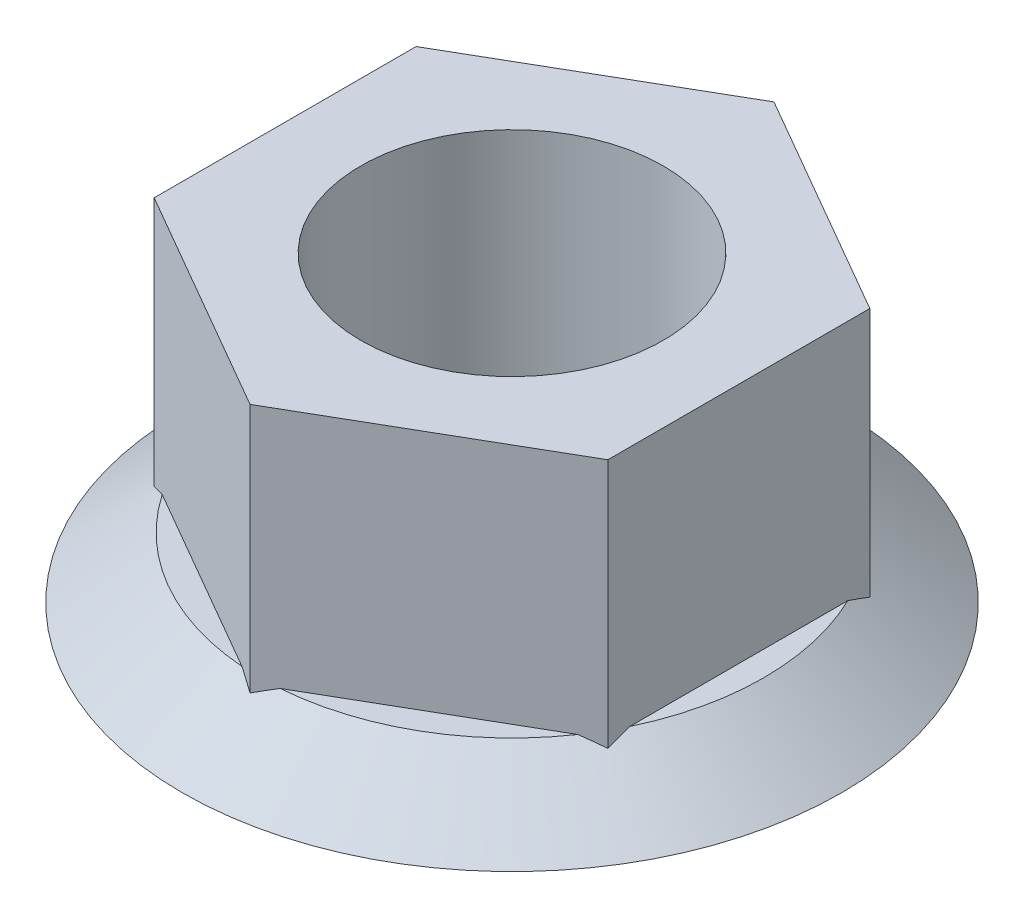
ISO-10303-21;
HEADER;
FILE_DESCRIPTION(('STEP AP214'),'2;1');
FILE_NAME('part.step','',(''),(''),'','','');
FILE_SCHEMA(('AUTOMOTIVE_DESIGN { 1 0 10303 214 1 1 1 1 }'));
ENDSEC;
DATA;
#1=APPLICATION_CONTEXT('core data for automotive mechanical design processes');
#2=APPLICATION_PROTOCOL_DEFINITION('international standard','automotive_design',2000,#1);
#3=PRODUCT_CONTEXT('',#1,'mechanical');
#4=PRODUCT('Part','Part','',(#3));
#5=PRODUCT_RELATED_PRODUCT_CATEGORY('part','',(#4));
#6=PRODUCT_DEFINITION_FORMATION('','',#4);
#7=PRODUCT_DEFINITION_CONTEXT('part definition',#1,'design');
#8=PRODUCT_DEFINITION('design','',#6,#7);
#9=PRODUCT_DEFINITION_SHAPE('','',#8);
#10=(LENGTH_UNIT() NAMED_UNIT(*) SI_UNIT(.MILLI.,.METRE.));
#11=(NAMED_UNIT(*) PLANE_ANGLE_UNIT() SI_UNIT($,.RADIAN.));
#12=(NAMED_UNIT(*) SI_UNIT($,.STERADIAN.) SOLID_ANGLE_UNIT());
#13=UNCERTAINTY_MEASURE_WITH_UNIT(LENGTH_MEASURE(1.E-05),#10,'distance_accuracy_value','');
#14=(GEOMETRIC_REPRESENTATION_CONTEXT(3) GLOBAL_UNCERTAINTY_ASSIGNED_CONTEXT((#13)) GLOBAL_UNIT_ASSIGNED_CONTEXT((#10,
#11,#12)) REPRESENTATION_CONTEXT('',''));
#15=CARTESIAN_POINT('',(0.,0.,0.));
#16=DIRECTION('',(0.,0.,1.));
#17=DIRECTION('',(1.,0.,0.));
#18=AXIS2_PLACEMENT_3D('',#15,#16,#17);
#19=CARTESIAN_POINT('',(5.,2.,0.));
#20=DIRECTION('',(0.,1.,0.));
#21=DIRECTION('',(0.,0.,1.));
#22=AXIS2_PLACEMENT_3D('',#19,#20,#21);
#23=PLANE('',#22);
#24=DIRECTION('',(0.866025403784439,0.,-0.5));
#25=VECTOR('',#24,1.);
#26=CARTESIAN_POINT('',(7.5,2.,4.3301270189222));
#27=LINE('',#26,#25);
#28=CARTESIAN_POINT('',(0.630817414770335,2.,8.29605143361723));
#29=VERTEX_POINT('',#28);
#30=CARTESIAN_POINT('',(6.86918258522966,2.,4.69432962314936));
#31=VERTEX_POINT('',#30);
#32=EDGE_CURVE('E202',#29,#31,#27,.T.);
#33=ORIENTED_EDGE('',*,*,#32,.F.);
#34=CARTESIAN_POINT('',(0.,2.,0.));
#35=DIRECTION('',(0.,-1.,0.));
#36=DIRECTION('',(0.,0.,-1.));
#37=AXIS2_PLACEMENT_3D('',#34,#35,#36);
#38=CIRCLE('',#37,8.32);
#39=EDGE_CURVE('E382',#31,#29,#38,.T.);
#40=ORIENTED_EDGE('',*,*,#39,.F.);
#41=EDGE_LOOP('',(#33,#40));
#42=FACE_BOUND('',#41,.T.);
#43=ADVANCED_FACE('F39',(#42),#23,.T.);
#44=DIRECTION('',(0.,0.,-1.));
#45=VECTOR('',#44,1.);
#46=CARTESIAN_POINT('',(7.5,2.,0.));
#47=LINE('',#46,#45);
#48=CARTESIAN_POINT('',(7.5,2.,3.60172181046788));
#49=VERTEX_POINT('',#48);
#50=CARTESIAN_POINT('',(7.5,2.,-3.60172181046788));
#51=VERTEX_POINT('',#50);
#52=EDGE_CURVE('E199',#49,#51,#47,.T.);
#53=ORIENTED_EDGE('',*,*,#52,.F.);
#54=EDGE_CURVE('E212',#51,#49,#38,.T.);
#55=ORIENTED_EDGE('',*,*,#54,.F.);
#56=EDGE_LOOP('',(#53,#55));
#57=FACE_BOUND('',#56,.T.);
#58=ADVANCED_FACE('F247',(#57),#23,.T.);
#59=DIRECTION('',(-0.866025403784439,0.,-0.5));
#60=VECTOR('',#59,1.);
#61=CARTESIAN_POINT('',(7.5,2.,-4.3301270189222));
#62=LINE('',#61,#60);
#63=CARTESIAN_POINT('',(6.86918258522966,2.,-4.69432962314936));
#64=VERTEX_POINT('',#63);
#65=CARTESIAN_POINT('',(0.630817414770343,2.,-8.29605143361723));
#66=VERTEX_POINT('',#65);
#67=EDGE_CURVE('E196',#64,#66,#62,.T.);
#68=ORIENTED_EDGE('',*,*,#67,.F.);
#69=EDGE_CURVE('E209',#66,#64,#38,.T.);
#70=ORIENTED_EDGE('',*,*,#69,.F.);
#71=EDGE_LOOP('',(#68,#70));
#72=FACE_BOUND('',#71,.T.);
#73=ADVANCED_FACE('F252',(#72),#23,.T.);
#74=DIRECTION('',(-0.866025403784439,0.,0.5));
#75=VECTOR('',#74,1.);
#76=CARTESIAN_POINT('',(0.,2.,-8.66025403784439));
#77=LINE('',#76,#75);
#78=CARTESIAN_POINT('',(-0.630817414770341,2.,-8.29605143361723));
#79=VERTEX_POINT('',#78);
#80=CARTESIAN_POINT('',(-6.86918258522966,2.,-4.69432962314936));
#81=VERTEX_POINT('',#80);
#82=EDGE_CURVE('E193',#79,#81,#77,.T.);
#83=ORIENTED_EDGE('',*,*,#82,.F.);
#84=EDGE_CURVE('E208',#81,#79,#38,.T.);
#85=ORIENTED_EDGE('',*,*,#84,.F.);
#86=EDGE_LOOP('',(#83,#85));
#87=FACE_BOUND('',#86,.T.);
#88=ADVANCED_FACE('F263',(#87),#23,.T.);
#89=DIRECTION('',(0.,0.,1.));
#90=VECTOR('',#89,1.);
#91=CARTESIAN_POINT('',(-7.5,2.,0.));
#92=LINE('',#91,#90);
#93=CARTESIAN_POINT('',(-7.5,2.,-3.60172181046788));
#94=VERTEX_POINT('',#93);
#95=CARTESIAN_POINT('',(-7.5,2.,3.60172181046788));
#96=VERTEX_POINT('',#95);
#97=EDGE_CURVE('E190',#94,#96,#92,.T.);
#98=ORIENTED_EDGE('',*,*,#97,.F.);
#99=EDGE_CURVE('E273',#96,#94,#38,.T.);
#100=ORIENTED_EDGE('',*,*,#99,.F.);
#101=EDGE_LOOP('',(#98,#100));
#102=FACE_BOUND('',#101,.T.);
#103=ADVANCED_FACE('F257',(#102),#23,.T.);
#104=CARTESIAN_POINT('',(10.9,0.,0.));
#105=DIRECTION('',(0.,-1.,0.));
#106=DIRECTION('',(0.,0.,-1.));
#107=AXIS2_PLACEMENT_3D('',#104,#105,#106);
#108=PLANE('',#107);
#109=CARTESIAN_POINT('',(0.,0.,0.));
#110=DIRECTION('',(0.,-1.,0.));
#111=DIRECTION('',(0.,0.,-1.));
#112=AXIS2_PLACEMENT_3D('',#109,#110,#111);
#113=CIRCLE('',#112,10.9);
#114=CARTESIAN_POINT('',(0.,0.,-10.9));
#115=VERTEX_POINT('',#114);
#116=EDGE_CURVE('E205',#115,#115,#113,.T.);
#117=ORIENTED_EDGE('',*,*,#116,.T.);
#118=EDGE_LOOP('',(#117));
#119=FACE_BOUND('',#118,.T.);
#120=CARTESIAN_POINT('',(0.,0.,0.));
#121=DIRECTION('',(0.,-1.,0.));
#122=DIRECTION('',(0.,0.,-1.));
#123=AXIS2_PLACEMENT_3D('',#120,#121,#122);
#124=CIRCLE('',#123,5.);
#125=CARTESIAN_POINT('',(0.,0.,-5.));
#126=VERTEX_POINT('',#125);
#127=EDGE_CURVE('E211',#126,#126,#124,.T.);
#128=ORIENTED_EDGE('',*,*,#127,.F.);
#129=EDGE_LOOP('',(#128));
#130=FACE_BOUND('',#129,.T.);
#131=ADVANCED_FACE('F41',(#119,#130),#108,.T.);
#132=CARTESIAN_POINT('',(0.,0.,0.));
#133=DIRECTION('',(0.,-1.,0.));
#134=DIRECTION('',(0.,0.,-1.));
#135=AXIS2_PLACEMENT_3D('',#132,#133,#134);
#136=CYLINDRICAL_SURFACE('',#135,5.);
#137=ORIENTED_EDGE('',*,*,#127,.T.);
#138=EDGE_LOOP('',(#137));
#139=FACE_BOUND('',#138,.T.);
#140=CARTESIAN_POINT('',(0.,10.,0.));
#141=DIRECTION('',(0.,-1.,0.));
#142=DIRECTION('',(0.,0.,-1.));
#143=AXIS2_PLACEMENT_3D('',#140,#141,#142);
#144=CIRCLE('',#143,5.);
#145=CARTESIAN_POINT('',(0.,10.,-5.));
#146=VERTEX_POINT('',#145);
#147=EDGE_CURVE('E164',#146,#146,#144,.T.);
#148=ORIENTED_EDGE('',*,*,#147,.F.);
#149=EDGE_LOOP('',(#148));
#150=FACE_BOUND('',#149,.T.);
#151=ADVANCED_FACE('F255',(#139,#150),#136,.F.);
#152=DIRECTION('',(0.866025403784439,0.,0.5));
#153=VECTOR('',#152,1.);
#154=CARTESIAN_POINT('',(0.,2.,8.66025403784439));
#155=LINE('',#154,#153);
#156=CARTESIAN_POINT('',(-6.86918258522967,2.,4.69432962314935));
#157=VERTEX_POINT('',#156);
#158=CARTESIAN_POINT('',(-0.630817414770336,2.,8.29605143361723));
#159=VERTEX_POINT('',#158);
#160=EDGE_CURVE('E178',#157,#159,#155,.T.);
#161=ORIENTED_EDGE('',*,*,#160,.F.);
#162=EDGE_CURVE('E281',#159,#157,#38,.T.);
#163=ORIENTED_EDGE('',*,*,#162,.F.);
#164=EDGE_LOOP('',(#161,#163));
#165=FACE_BOUND('',#164,.T.);
#166=ADVANCED_FACE('F245',(#165),#23,.T.);
#167=CARTESIAN_POINT('',(0.,0.,0.));
#168=DIRECTION('',(0.,-1.,0.));
#169=DIRECTION('',(0.,0.,-1.));
#170=AXIS2_PLACEMENT_3D('',#167,#168,#169);
#171=CONICAL_SURFACE('',#170,10.9,0.911365193087328);
#172=CARTESIAN_POINT('',(-0.000700000000002178,1.73592386719251,8.66065818303282));
#173=CARTESIAN_POINT('',(0.268389408925908,1.85631514514976,8.50529934035337));
#174=CARTESIAN_POINT('',(0.540534737284686,1.96847451679786,8.34817616176673));
#175=CARTESIAN_POINT('',(1.0915884474878,2.17158545893725,8.03002515384302));
#176=CARTESIAN_POINT('',(1.37051533007097,2.26246955642398,7.86898664309941));
#177=CARTESIAN_POINT('',(1.93141494908349,2.41673118023484,7.54515109707416));
#178=CARTESIAN_POINT('',(2.21333344391363,2.48036222679627,7.38238537819445));
#179=CARTESIAN_POINT('',(2.63895787431339,2.55253585716155,7.13665099872947));
#180=CARTESIAN_POINT('',(2.78122773222445,2.57271117259574,7.05451145796695));
#181=CARTESIAN_POINT('',(3.06645056377147,2.60492146284133,6.88983797939425));
#182=CARTESIAN_POINT('',(3.2094034405288,2.61695755950126,6.80730409751698));
#183=CARTESIAN_POINT('',(3.49779035296303,2.632725374555,6.6408038359923));
#184=CARTESIAN_POINT('',(3.64322959325228,2.63633055090466,6.55683445146057));
#185=CARTESIAN_POINT('',(3.93407361091827,2.6347813962971,6.38891557956892));
#186=CARTESIAN_POINT('',(4.07947838807679,2.62962701128285,6.30496609233499));
#187=CARTESIAN_POINT('',(4.36992855566483,2.61067710314533,6.13727460989186));
#188=CARTESIAN_POINT('',(4.51497375835032,2.59687775300658,6.05353272307673));
#189=CARTESIAN_POINT('',(4.80429671618382,2.56096295264623,5.88649203548882));
#190=CARTESIAN_POINT('',(4.94857436392031,2.53884636802417,5.80319329673012));
#191=CARTESIAN_POINT('',(5.37971074616831,2.46072666445574,5.55427659038179));
#192=CARTESIAN_POINT('',(5.66500402468202,2.3929443127109,5.38956243923391));
#193=CARTESIAN_POINT('',(6.22969366481773,2.23099044677286,5.06353872349297));
#194=CARTESIAN_POINT('',(6.50909130684158,2.13682472723256,4.90222841965955));
#195=CARTESIAN_POINT('',(6.90591440935705,1.98643672882274,4.67312249460158));
#196=CARTESIAN_POINT('',(7.02583473539765,1.938760142074,4.60388646208073));
#197=CARTESIAN_POINT('',(7.26424813674059,1.83989721701588,4.46623842063697));
#198=CARTESIAN_POINT('',(7.38274403279456,1.78871996069957,4.39782478315235));
#199=CARTESIAN_POINT('',(7.5007,1.73592386719252,4.32972287373376));
#200=B_SPLINE_CURVE_WITH_KNOTS('',3,(#172,#173,#174,#175,#176,#177,#178,#179,#180,#181,#182,
#183,#184,#185,#186,#187,#188,#189,#190,#191,#192,#193,#194,#195,#196,#197,#198,#199),
.UNSPECIFIED.,.F.,.F.,(4,2,2,2,2,2,2,2,2,2,2,2,2,4),(0.,1.00002476512066,2.00317932352939,
2.9967879546945,3.49315888986408,3.98946139505531,4.49316652283007,4.99687475908305,
5.50080613825042,6.0048062743389,7.01235348236888,8.01967957322136,8.45899100265984,
8.89720302420391),.UNSPECIFIED.);
#201=CARTESIAN_POINT('',(7.5,1.73623717996559,4.3301270189222));
#202=VERTEX_POINT('',#201);
#203=EDGE_CURVE('E11',#31,#202,#200,.T.);
#204=ORIENTED_EDGE('',*,*,#203,.F.);
#205=ORIENTED_EDGE('',*,*,#39,.T.);
#206=CARTESIAN_POINT('',(0.,1.73623717996559,8.66025403784439));
#207=VERTEX_POINT('',#206);
#208=EDGE_CURVE('E56',#207,#29,#200,.T.);
#209=ORIENTED_EDGE('',*,*,#208,.F.);
#210=CARTESIAN_POINT('',(-7.5007,1.73592386719251,4.32972287373376));
#211=CARTESIAN_POINT('',(-7.23161059107409,1.85631514514976,4.48508171641321));
#212=CARTESIAN_POINT('',(-6.95946526271531,1.96847451679786,4.64220489499985));
#213=CARTESIAN_POINT('',(-6.4084115525122,2.17158545893725,4.96035590292356));
#214=CARTESIAN_POINT('',(-6.12948466992903,2.26246955642398,5.12139441366718));
#215=CARTESIAN_POINT('',(-5.5685850509165,2.41673118023484,5.44522995969242));
#216=CARTESIAN_POINT('',(-5.28666655608637,2.48036222679627,5.60799567857213));
#217=CARTESIAN_POINT('',(-4.8610421256866,2.55253585716155,5.85373005803711));
#218=CARTESIAN_POINT('',(-4.71877226777554,2.57271117259574,5.93586959879964));
#219=CARTESIAN_POINT('',(-4.43354943622852,2.60492146284133,6.10054307737234));
#220=CARTESIAN_POINT('',(-4.2905965594712,2.61695755950126,6.18307695924961));
#221=CARTESIAN_POINT('',(-4.00220964703696,2.632725374555,6.34957722077428));
#222=CARTESIAN_POINT('',(-3.85677040674772,2.63633055090466,6.43354660530601));
#223=CARTESIAN_POINT('',(-3.56592638908173,2.6347813962971,6.60146547719766));
#224=CARTESIAN_POINT('',(-3.4205216119232,2.62962701128285,6.68541496443159));
#225=CARTESIAN_POINT('',(-3.13007144433516,2.61067710314533,6.85310644687472));
#226=CARTESIAN_POINT('',(-2.98502624164967,2.59687775300659,6.93684833368985));
#227=CARTESIAN_POINT('',(-2.69570328381617,2.56096295264623,7.10388902127776));
#228=CARTESIAN_POINT('',(-2.55142563607968,2.53884636802417,7.18718776003647));
#229=CARTESIAN_POINT('',(-2.12028925383169,2.46072666445575,7.43610446638479));
#230=CARTESIAN_POINT('',(-1.83499597531798,2.39294431271091,7.60081861753267));
#231=CARTESIAN_POINT('',(-1.27030633518227,2.23099044677286,7.92684233327362));
#232=CARTESIAN_POINT('',(-0.990908693158412,2.13682472723256,8.08815263710704));
#233=CARTESIAN_POINT('',(-0.59408559064295,1.98643672882274,8.317258562165));
#234=CARTESIAN_POINT('',(-0.47416526460235,1.938760142074,8.38649459468585));
#235=CARTESIAN_POINT('',(-0.235751863259407,1.83989721701588,8.52414263612961));
#236=CARTESIAN_POINT('',(-0.117255967205442,1.78871996069957,8.59255627361424));
#237=CARTESIAN_POINT('',(0.000700000000000418,1.73592386719252,8.66065818303282));
#238=B_SPLINE_CURVE_WITH_KNOTS('',3,(#210,#211,#212,#213,#214,#215,#216,#217,#218,#219,#220,
#221,#222,#223,#224,#225,#226,#227,#228,#229,#230,#231,#232,#233,#234,#235,#236,#237),
.UNSPECIFIED.,.F.,.F.,(4,2,2,2,2,2,2,2,2,2,2,2,2,4),(0.,1.00002476512066,2.00317932352939,
2.9967879546945,3.49315888986408,3.98946139505531,4.49316652283007,4.99687475908305,
5.50080613825042,6.0048062743389,7.01235348236889,8.01967957322136,8.45899100265984,
8.89720302420391),.UNSPECIFIED.);
#239=EDGE_CURVE('E143',#159,#207,#238,.T.);
#240=ORIENTED_EDGE('',*,*,#239,.F.);
#241=ORIENTED_EDGE('',*,*,#162,.T.);
#242=CARTESIAN_POINT('',(-7.5,1.73623717996559,4.33012701892219));
#243=VERTEX_POINT('',#242);
#244=EDGE_CURVE('E220',#243,#157,#238,.T.);
#245=ORIENTED_EDGE('',*,*,#244,.F.);
#246=CARTESIAN_POINT('',(-7.5,1.73596584568903,-4.3308270189222));
#247=CARTESIAN_POINT('',(-7.5,1.85635405916538,-4.02011145178652));
#248=CARTESIAN_POINT('',(-7.5,1.96851025419298,-3.70586723223685));
#249=CARTESIAN_POINT('',(-7.5,2.17161469902942,-3.06956966576628));
#250=CARTESIAN_POINT('',(-7.5,2.26249547785335,-2.74749495720677));
#251=CARTESIAN_POINT('',(-7.5,2.41675049417673,-2.09982864354552));
#252=CARTESIAN_POINT('',(-7.5,2.48037824777507,-1.77429966803174));
#253=CARTESIAN_POINT('',(-7.5,2.55254710015498,-1.28283482268769));
#254=CARTESIAN_POINT('',(-7.5,2.57272085058749,-1.11855707979075));
#255=CARTESIAN_POINT('',(-7.5,2.60492809985604,-0.789212876813316));
#256=CARTESIAN_POINT('',(-7.5,2.6169627205044,-0.624146528585549));
#257=CARTESIAN_POINT('',(-7.5,2.63272768019158,-0.291149094367258));
#258=CARTESIAN_POINT('',(-7.5,2.6363314873941,-0.123212000132435));
#259=CARTESIAN_POINT('',(-7.5,2.6347797752516,0.212622327404711));
#260=CARTESIAN_POINT('',(-7.5,2.62962420184423,0.380519560454619));
#261=CARTESIAN_POINT('',(-7.5,2.61067212317701,0.715898994328078));
#262=CARTESIAN_POINT('',(-7.5,2.59687179087177,0.883380978334573));
#263=CARTESIAN_POINT('',(-7.5,2.56095524639862,1.21745874463158));
#264=CARTESIAN_POINT('',(-7.5,2.53883789988567,1.38405440289277));
#265=CARTESIAN_POINT('',(-7.5,2.4607162562717,1.88188228955899));
#266=CARTESIAN_POINT('',(-7.5,2.39293306768887,2.21130686936423));
#267=CARTESIAN_POINT('',(-7.5,2.23097833326074,2.86334694619134));
#268=CARTESIAN_POINT('',(-7.5,2.13681258288732,3.18596392192544));
#269=CARTESIAN_POINT('',(-7.5,1.98643255036416,3.64414762094844));
#270=CARTESIAN_POINT('',(-7.5,1.93876437155069,3.78259533344111));
#271=CARTESIAN_POINT('',(-7.5,1.83991946542343,4.05784327985163));
#272=CARTESIAN_POINT('',(-7.5,1.78875181560294,4.19464676925649));
#273=CARTESIAN_POINT('',(-7.5,1.73596584568904,4.3308270189222));
#274=B_SPLINE_CURVE_WITH_KNOTS('',3,(#246,#247,#248,#249,#250,#251,#252,#253,#254,#255,#256,
#257,#258,#259,#260,#261,#262,#263,#264,#265,#266,#267,#268,#269,#270,#271,#272,#273),
.UNSPECIFIED.,.F.,.F.,(4,2,2,2,2,2,2,2,2,2,2,2,2,4),(0.,1.00001551112094,2.00316067522908,
2.99676016318638,3.49312654251565,3.989424493957,4.49312451668006,4.99682764821905,
5.50075392749744,6.00474896146474,7.01228580773261,8.01960150112593,8.45883566498247,
8.89697078267583),.UNSPECIFIED.);
#275=EDGE_CURVE('E280',#96,#243,#274,.T.);
#276=ORIENTED_EDGE('',*,*,#275,.F.);
#277=ORIENTED_EDGE('',*,*,#99,.T.);
#278=CARTESIAN_POINT('',(-7.5,1.73623717996559,-4.3301270189222));
#279=VERTEX_POINT('',#278);
#280=EDGE_CURVE('E278',#279,#94,#274,.T.);
#281=ORIENTED_EDGE('',*,*,#280,.F.);
#282=CARTESIAN_POINT('',(0.000700000000002626,1.73592386719251,-8.66065818303282));
#283=CARTESIAN_POINT('',(-0.268389408925909,1.85631514514976,-8.50529934035337));
#284=CARTESIAN_POINT('',(-0.540534737284687,1.96847451679786,-8.34817616176673));
#285=CARTESIAN_POINT('',(-1.0915884474878,2.17158545893724,-8.03002515384302));
#286=CARTESIAN_POINT('',(-1.37051533007097,2.26246955642398,-7.86898664309941));
#287=CARTESIAN_POINT('',(-1.9314149490835,2.41673118023484,-7.54515109707416));
#288=CARTESIAN_POINT('',(-2.21333344391363,2.48036222679627,-7.38238537819445));
#289=CARTESIAN_POINT('',(-2.63895787431339,2.55253585716155,-7.13665099872947));
#290=CARTESIAN_POINT('',(-2.78122773222445,2.57271117259574,-7.05451145796695));
#291=CARTESIAN_POINT('',(-3.06645056377148,2.60492146284133,-6.88983797939425));
#292=CARTESIAN_POINT('',(-3.2094034405288,2.61695755950126,-6.80730409751698));
#293=CARTESIAN_POINT('',(-3.49779035296304,2.63272537455499,-6.6408038359923));
#294=CARTESIAN_POINT('',(-3.64322959325228,2.63633055090466,-6.55683445146057));
#295=CARTESIAN_POINT('',(-3.93407361091827,2.6347813962971,-6.38891557956892));
#296=CARTESIAN_POINT('',(-4.0794783880768,2.62962701128284,-6.30496609233499));
#297=CARTESIAN_POINT('',(-4.36992855566484,2.61067710314532,-6.13727460989186));
#298=CARTESIAN_POINT('',(-4.51497375835033,2.59687775300658,-6.05353272307673));
#299=CARTESIAN_POINT('',(-4.80429671618383,2.56096295264623,-5.88649203548882));
#300=CARTESIAN_POINT('',(-4.94857436392032,2.53884636802416,-5.80319329673011));
#301=CARTESIAN_POINT('',(-5.37971074616831,2.46072666445574,-5.55427659038179));
#302=CARTESIAN_POINT('',(-5.66500402468202,2.3929443127109,-5.38956243923391));
#303=CARTESIAN_POINT('',(-6.22969366481774,2.23099044677286,-5.06353872349296));
#304=CARTESIAN_POINT('',(-6.50909130684159,2.13682472723256,-4.90222841965954));
#305=CARTESIAN_POINT('',(-6.90591440935705,1.98643672882274,-4.67312249460158));
#306=CARTESIAN_POINT('',(-7.02583473539765,1.938760142074,-4.60388646208073));
#307=CARTESIAN_POINT('',(-7.26424813674059,1.83989721701588,-4.46623842063697));
#308=CARTESIAN_POINT('',(-7.38274403279456,1.78871996069956,-4.39782478315235));
#309=CARTESIAN_POINT('',(-7.5007,1.73592386719252,-4.32972287373376));
#310=B_SPLINE_CURVE_WITH_KNOTS('',3,(#282,#283,#284,#285,#286,#287,#288,#289,#290,#291,#292,
#293,#294,#295,#296,#297,#298,#299,#300,#301,#302,#303,#304,#305,#306,#307,#308,#309),
.UNSPECIFIED.,.F.,.F.,(4,2,2,2,2,2,2,2,2,2,2,2,2,4),(0.,1.00002476512066,2.00317932352939,
2.9967879546945,3.49315888986409,3.98946139505532,4.49316652283007,4.99687475908306,
5.50080613825042,6.00480627433891,7.01235348236889,8.01967957322137,8.45899100265984,
8.89720302420391),.UNSPECIFIED.);
#311=EDGE_CURVE('E282',#81,#279,#310,.T.);
#312=ORIENTED_EDGE('',*,*,#311,.F.);
#313=ORIENTED_EDGE('',*,*,#84,.T.);
#314=CARTESIAN_POINT('',(0.,1.73623717996559,-8.66025403784439));
#315=VERTEX_POINT('',#314);
#316=EDGE_CURVE('E283',#315,#79,#310,.T.);
#317=ORIENTED_EDGE('',*,*,#316,.F.);
#318=CARTESIAN_POINT('',(7.5007,1.73592386719251,-4.32972287373376));
#319=CARTESIAN_POINT('',(7.23161059107409,1.85631514514976,-4.48508171641322));
#320=CARTESIAN_POINT('',(6.95946526271531,1.96847451679786,-4.64220489499986));
#321=CARTESIAN_POINT('',(6.4084115525122,2.17158545893724,-4.96035590292357));
#322=CARTESIAN_POINT('',(6.12948466992903,2.26246955642398,-5.12139441366718));
#323=CARTESIAN_POINT('',(5.5685850509165,2.41673118023484,-5.44522995969242));
#324=CARTESIAN_POINT('',(5.28666655608637,2.48036222679627,-5.60799567857213));
#325=CARTESIAN_POINT('',(4.8610421256866,2.55253585716155,-5.85373005803712));
#326=CARTESIAN_POINT('',(4.71877226777554,2.57271117259574,-5.93586959879964));
#327=CARTESIAN_POINT('',(4.43354943622852,2.60492146284133,-6.10054307737234));
#328=CARTESIAN_POINT('',(4.2905965594712,2.61695755950125,-6.18307695924961));
#329=CARTESIAN_POINT('',(4.00220964703696,2.63272537455499,-6.34957722077428));
#330=CARTESIAN_POINT('',(3.85677040674772,2.63633055090466,-6.43354660530601));
#331=CARTESIAN_POINT('',(3.56592638908173,2.6347813962971,-6.60146547719766));
#332=CARTESIAN_POINT('',(3.4205216119232,2.62962701128284,-6.6854149644316));
#333=CARTESIAN_POINT('',(3.13007144433516,2.61067710314532,-6.85310644687472));
#334=CARTESIAN_POINT('',(2.98502624164967,2.59687775300658,-6.93684833368985));
#335=CARTESIAN_POINT('',(2.69570328381617,2.56096295264623,-7.10388902127777));
#336=CARTESIAN_POINT('',(2.55142563607968,2.53884636802416,-7.18718776003647));
#337=CARTESIAN_POINT('',(2.12028925383169,2.46072666445574,-7.43610446638479));
#338=CARTESIAN_POINT('',(1.83499597531798,2.3929443127109,-7.60081861753268));
#339=CARTESIAN_POINT('',(1.27030633518227,2.23099044677286,-7.92684233327362));
#340=CARTESIAN_POINT('',(0.990908693158409,2.13682472723256,-8.08815263710704));
#341=CARTESIAN_POINT('',(0.594085590642947,1.98643672882274,-8.31725856216501));
#342=CARTESIAN_POINT('',(0.474165264602349,1.938760142074,-8.38649459468585));
#343=CARTESIAN_POINT('',(0.235751863259407,1.83989721701588,-8.52414263612961));
#344=CARTESIAN_POINT('',(0.117255967205443,1.78871996069956,-8.59255627361424));
#345=CARTESIAN_POINT('',(-0.000699999999998407,1.73592386719252,-8.66065818303282));
#346=B_SPLINE_CURVE_WITH_KNOTS('',3,(#318,#319,#320,#321,#322,#323,#324,#325,#326,#327,#328,
#329,#330,#331,#332,#333,#334,#335,#336,#337,#338,#339,#340,#341,#342,#343,#344,#345),
.UNSPECIFIED.,.F.,.F.,(4,2,2,2,2,2,2,2,2,2,2,2,2,4),(0.,1.00002476512066,2.00317932352939,
2.9967879546945,3.49315888986409,3.98946139505532,4.49316652283007,4.99687475908305,
5.50080613825042,6.00480627433891,7.01235348236889,8.01967957322137,8.45899100265984,
8.8972030242039),.UNSPECIFIED.);
#347=EDGE_CURVE('E293',#66,#315,#346,.T.);
#348=ORIENTED_EDGE('',*,*,#347,.F.);
#349=ORIENTED_EDGE('',*,*,#69,.T.);
#350=CARTESIAN_POINT('',(7.5,1.73623717996559,-4.3301270189222));
#351=VERTEX_POINT('',#350);
#352=EDGE_CURVE('E68',#351,#64,#346,.T.);
#353=ORIENTED_EDGE('',*,*,#352,.F.);
#354=CARTESIAN_POINT('',(7.5,1.73596584568903,4.3308270189222));
#355=CARTESIAN_POINT('',(7.5,1.85635405916538,4.02011145178652));
#356=CARTESIAN_POINT('',(7.5,1.96851025419298,3.70586723223685));
#357=CARTESIAN_POINT('',(7.5,2.17161469902942,3.06956966576628));
#358=CARTESIAN_POINT('',(7.5,2.26249547785335,2.74749495720677));
#359=CARTESIAN_POINT('',(7.5,2.41675049417673,2.09982864354552));
#360=CARTESIAN_POINT('',(7.5,2.48037824777507,1.77429966803174));
#361=CARTESIAN_POINT('',(7.5,2.55254710015498,1.28283482268769));
#362=CARTESIAN_POINT('',(7.5,2.57272085058749,1.11855707979075));
#363=CARTESIAN_POINT('',(7.5,2.60492809985604,0.789212876813316));
#364=CARTESIAN_POINT('',(7.5,2.6169627205044,0.624146528585549));
#365=CARTESIAN_POINT('',(7.5,2.63272768019158,0.291149094367257));
#366=CARTESIAN_POINT('',(7.5,2.6363314873941,0.123212000132435));
#367=CARTESIAN_POINT('',(7.5,2.6347797752516,-0.212622327404712));
#368=CARTESIAN_POINT('',(7.5,2.62962420184423,-0.380519560454619));
#369=CARTESIAN_POINT('',(7.5,2.61067212317701,-0.715898994328079));
#370=CARTESIAN_POINT('',(7.5,2.59687179087177,-0.883380978334573));
#371=CARTESIAN_POINT('',(7.5,2.56095524639862,-1.21745874463158));
#372=CARTESIAN_POINT('',(7.5,2.53883789988567,-1.38405440289277));
#373=CARTESIAN_POINT('',(7.5,2.4607162562717,-1.88188228955899));
#374=CARTESIAN_POINT('',(7.5,2.39293306768887,-2.21130686936423));
#375=CARTESIAN_POINT('',(7.5,2.23097833326074,-2.86334694619134));
#376=CARTESIAN_POINT('',(7.5,2.13681258288732,-3.18596392192544));
#377=CARTESIAN_POINT('',(7.5,1.98643255036416,-3.64414762094844));
#378=CARTESIAN_POINT('',(7.5,1.93876437155069,-3.78259533344111));
#379=CARTESIAN_POINT('',(7.5,1.83991946542343,-4.05784327985164));
#380=CARTESIAN_POINT('',(7.5,1.78875181560294,-4.1946467692565));
#381=CARTESIAN_POINT('',(7.5,1.73596584568904,-4.3308270189222));
#382=B_SPLINE_CURVE_WITH_KNOTS('',3,(#354,#355,#356,#357,#358,#359,#360,#361,#362,#363,#364,
#365,#366,#367,#368,#369,#370,#371,#372,#373,#374,#375,#376,#377,#378,#379,#380,#381),
.UNSPECIFIED.,.F.,.F.,(4,2,2,2,2,2,2,2,2,2,2,2,2,4),(0.,1.00001551112094,2.00316067522908,
2.99676016318638,3.49312654251565,3.989424493957,4.49312451668006,4.99682764821905,
5.50075392749744,6.00474896146474,7.01228580773261,8.01960150112593,8.45883566498247,
8.89697078267583),.UNSPECIFIED.);
#383=EDGE_CURVE('E43',#51,#351,#382,.T.);
#384=ORIENTED_EDGE('',*,*,#383,.F.);
#385=ORIENTED_EDGE('',*,*,#54,.T.);
#386=EDGE_CURVE('E54',#202,#49,#382,.T.);
#387=ORIENTED_EDGE('',*,*,#386,.F.);
#388=EDGE_LOOP('',(#204,#205,#209,#240,#241,#245,#276,#277,#281,#312,#313,#317,#348,#349,#353,
#384,#385,#387));
#389=FACE_BOUND('',#388,.T.);
#390=ORIENTED_EDGE('',*,*,#116,.F.);
#391=EDGE_LOOP('',(#390));
#392=FACE_BOUND('',#391,.T.);
#393=ADVANCED_FACE('F227',(#389,#392),#171,.T.);
#394=CARTESIAN_POINT('',(11.925,10.,1.7753520777581));
#395=DIRECTION('',(0.5,0.,0.866025403784439));
#396=DIRECTION('',(0.866025403784439,0.,-0.5));
#397=AXIS2_PLACEMENT_3D('',#394,#395,#396);
#398=PLANE('',#397);
#399=DIRECTION('',(0.,-1.,0.));
#400=VECTOR('',#399,1.);
#401=CARTESIAN_POINT('',(0.,10.,8.66025403784439));
#402=LINE('',#401,#400);
#403=CARTESIAN_POINT('',(0.,10.,8.66025403784439));
#404=VERTEX_POINT('',#403);
#405=EDGE_CURVE('E137',#404,#207,#402,.T.);
#406=ORIENTED_EDGE('',*,*,#405,.T.);
#407=ORIENTED_EDGE('',*,*,#208,.T.);
#408=ORIENTED_EDGE('',*,*,#32,.T.);
#409=ORIENTED_EDGE('',*,*,#203,.T.);
#410=DIRECTION('',(0.,-1.,0.));
#411=VECTOR('',#410,1.);
#412=CARTESIAN_POINT('',(7.5,10.,4.3301270189222));
#413=LINE('',#412,#411);
#414=CARTESIAN_POINT('',(7.5,10.,4.3301270189222));
#415=VERTEX_POINT('',#414);
#416=EDGE_CURVE('E163',#415,#202,#413,.T.);
#417=ORIENTED_EDGE('',*,*,#416,.F.);
#418=DIRECTION('',(-0.866025403784439,0.,0.5));
#419=VECTOR('',#418,1.);
#420=CARTESIAN_POINT('',(11.925,10.,1.7753520777581));
#421=LINE('',#420,#419);
#422=EDGE_CURVE('E155',#415,#404,#421,.T.);
#423=ORIENTED_EDGE('',*,*,#422,.T.);
#424=EDGE_LOOP('',(#406,#407,#408,#409,#417,#423));
#425=FACE_BOUND('',#424,.T.);
#426=ADVANCED_FACE('F161',(#425),#398,.T.);
#427=CARTESIAN_POINT('',(7.5,10.,0.));
#428=DIRECTION('',(1.,0.,0.));
#429=DIRECTION('',(0.,0.,-1.));
#430=AXIS2_PLACEMENT_3D('',#427,#428,#429);
#431=PLANE('',#430);
#432=ORIENTED_EDGE('',*,*,#416,.T.);
#433=ORIENTED_EDGE('',*,*,#386,.T.);
#434=ORIENTED_EDGE('',*,*,#52,.T.);
#435=ORIENTED_EDGE('',*,*,#383,.T.);
#436=DIRECTION('',(0.,-1.,0.));
#437=VECTOR('',#436,1.);
#438=CARTESIAN_POINT('',(7.5,10.,-4.3301270189222));
#439=LINE('',#438,#437);
#440=CARTESIAN_POINT('',(7.5,10.,-4.3301270189222));
#441=VERTEX_POINT('',#440);
#442=EDGE_CURVE('E179',#441,#351,#439,.T.);
#443=ORIENTED_EDGE('',*,*,#442,.F.);
#444=DIRECTION('',(0.,0.,1.));
#445=VECTOR('',#444,1.);
#446=CARTESIAN_POINT('',(7.5,10.,0.));
#447=LINE('',#446,#445);
#448=EDGE_CURVE('E148',#441,#415,#447,.T.);
#449=ORIENTED_EDGE('',*,*,#448,.T.);
#450=EDGE_LOOP('',(#432,#433,#434,#435,#443,#449));
#451=FACE_BOUND('',#450,.T.);
#452=ADVANCED_FACE('F238',(#451),#431,.T.);
#453=CARTESIAN_POINT('',(11.925,10.,-1.7753520777581));
#454=DIRECTION('',(0.5,0.,-0.866025403784439));
#455=DIRECTION('',(-0.866025403784439,0.,-0.5));
#456=AXIS2_PLACEMENT_3D('',#453,#454,#455);
#457=PLANE('',#456);
#458=ORIENTED_EDGE('',*,*,#442,.T.);
#459=ORIENTED_EDGE('',*,*,#352,.T.);
#460=ORIENTED_EDGE('',*,*,#67,.T.);
#461=ORIENTED_EDGE('',*,*,#347,.T.);
#462=DIRECTION('',(0.,-1.,0.));
#463=VECTOR('',#462,1.);
#464=CARTESIAN_POINT('',(0.,10.,-8.66025403784439));
#465=LINE('',#464,#463);
#466=CARTESIAN_POINT('',(0.,10.,-8.66025403784439));
#467=VERTEX_POINT('',#466);
#468=EDGE_CURVE('E182',#467,#315,#465,.T.);
#469=ORIENTED_EDGE('',*,*,#468,.F.);
#470=DIRECTION('',(0.866025403784439,0.,0.5));
#471=VECTOR('',#470,1.);
#472=CARTESIAN_POINT('',(11.925,10.,-1.7753520777581));
#473=LINE('',#472,#471);
#474=EDGE_CURVE('E173',#467,#441,#473,.T.);
#475=ORIENTED_EDGE('',*,*,#474,.T.);
#476=EDGE_LOOP('',(#458,#459,#460,#461,#469,#475));
#477=FACE_BOUND('',#476,.T.);
#478=ADVANCED_FACE('F243',(#477),#457,.T.);
#479=CARTESIAN_POINT('',(4.425,10.,-11.2150289790085));
#480=DIRECTION('',(-0.5,0.,-0.866025403784439));
#481=DIRECTION('',(-0.866025403784439,0.,0.5));
#482=AXIS2_PLACEMENT_3D('',#479,#480,#481);
#483=PLANE('',#482);
#484=ORIENTED_EDGE('',*,*,#468,.T.);
#485=ORIENTED_EDGE('',*,*,#316,.T.);
#486=ORIENTED_EDGE('',*,*,#82,.T.);
#487=ORIENTED_EDGE('',*,*,#311,.T.);
#488=DIRECTION('',(0.,-1.,0.));
#489=VECTOR('',#488,1.);
#490=CARTESIAN_POINT('',(-7.5,10.,-4.3301270189222));
#491=LINE('',#490,#489);
#492=CARTESIAN_POINT('',(-7.5,10.,-4.3301270189222));
#493=VERTEX_POINT('',#492);
#494=EDGE_CURVE('E185',#493,#279,#491,.T.);
#495=ORIENTED_EDGE('',*,*,#494,.F.);
#496=DIRECTION('',(0.866025403784439,0.,-0.5));
#497=VECTOR('',#496,1.);
#498=CARTESIAN_POINT('',(4.425,10.,-11.2150289790085));
#499=LINE('',#498,#497);
#500=EDGE_CURVE('E170',#493,#467,#499,.T.);
#501=ORIENTED_EDGE('',*,*,#500,.T.);
#502=EDGE_LOOP('',(#484,#485,#486,#487,#495,#501));
#503=FACE_BOUND('',#502,.T.);
#504=ADVANCED_FACE('F299',(#503),#483,.T.);
#505=CARTESIAN_POINT('',(-7.5,10.,0.));
#506=DIRECTION('',(-1.,0.,0.));
#507=DIRECTION('',(0.,0.,1.));
#508=AXIS2_PLACEMENT_3D('',#505,#506,#507);
#509=PLANE('',#508);
#510=ORIENTED_EDGE('',*,*,#494,.T.);
#511=ORIENTED_EDGE('',*,*,#280,.T.);
#512=ORIENTED_EDGE('',*,*,#97,.T.);
#513=ORIENTED_EDGE('',*,*,#275,.T.);
#514=DIRECTION('',(0.,-1.,0.));
#515=VECTOR('',#514,1.);
#516=CARTESIAN_POINT('',(-7.5,10.,4.33012701892219));
#517=LINE('',#516,#515);
#518=CARTESIAN_POINT('',(-7.5,10.,4.33012701892219));
#519=VERTEX_POINT('',#518);
#520=EDGE_CURVE('E147',#519,#243,#517,.T.);
#521=ORIENTED_EDGE('',*,*,#520,.F.);
#522=DIRECTION('',(0.,0.,-1.));
#523=VECTOR('',#522,1.);
#524=CARTESIAN_POINT('',(-7.5,10.,0.));
#525=LINE('',#524,#523);
#526=EDGE_CURVE('E159',#519,#493,#525,.T.);
#527=ORIENTED_EDGE('',*,*,#526,.T.);
#528=EDGE_LOOP('',(#510,#511,#512,#513,#521,#527));
#529=FACE_BOUND('',#528,.T.);
#530=ADVANCED_FACE('F233',(#529),#509,.T.);
#531=CARTESIAN_POINT('',(4.425,10.,11.2150289790085));
#532=DIRECTION('',(-0.5,0.,0.866025403784439));
#533=DIRECTION('',(0.866025403784439,0.,0.5));
#534=AXIS2_PLACEMENT_3D('',#531,#532,#533);
#535=PLANE('',#534);
#536=ORIENTED_EDGE('',*,*,#520,.T.);
#537=ORIENTED_EDGE('',*,*,#244,.T.);
#538=ORIENTED_EDGE('',*,*,#160,.T.);
#539=ORIENTED_EDGE('',*,*,#239,.T.);
#540=ORIENTED_EDGE('',*,*,#405,.F.);
#541=DIRECTION('',(-0.866025403784439,0.,-0.5));
#542=VECTOR('',#541,1.);
#543=CARTESIAN_POINT('',(4.425,10.,11.2150289790085));
#544=LINE('',#543,#542);
#545=EDGE_CURVE('E141',#404,#519,#544,.T.);
#546=ORIENTED_EDGE('',*,*,#545,.T.);
#547=EDGE_LOOP('',(#536,#537,#538,#539,#540,#546));
#548=FACE_BOUND('',#547,.T.);
#549=ADVANCED_FACE('F140',(#548),#535,.T.);
#550=CARTESIAN_POINT('',(0.,10.,0.));
#551=DIRECTION('',(0.,-1.,0.));
#552=DIRECTION('',(0.,0.,-1.));
#553=AXIS2_PLACEMENT_3D('',#550,#551,#552);
#554=PLANE('',#553);
#555=ORIENTED_EDGE('',*,*,#147,.T.);
#556=EDGE_LOOP('',(#555));
#557=FACE_BOUND('',#556,.T.);
#558=ORIENTED_EDGE('',*,*,#422,.F.);
#559=ORIENTED_EDGE('',*,*,#448,.F.);
#560=ORIENTED_EDGE('',*,*,#474,.F.);
#561=ORIENTED_EDGE('',*,*,#500,.F.);
#562=ORIENTED_EDGE('',*,*,#526,.F.);
#563=ORIENTED_EDGE('',*,*,#545,.F.);
#564=EDGE_LOOP('',(#558,#559,#560,#561,#562,#563));
#565=FACE_BOUND('',#564,.T.);
#566=ADVANCED_FACE('F153',(#557,#565),#554,.F.);
#567=CLOSED_SHELL('',(#43,#58,#73,#88,#103,#131,#151,#166,#393,#426,#452,#478,#504,#530,#549,#566));
#568=MANIFOLD_SOLID_BREP('B2',#567);
#569=ADVANCED_BREP_SHAPE_REPRESENTATION('',(#18,#568),#14);
#570=SHAPE_DEFINITION_REPRESENTATION(#9,#569);
ENDSEC;
END-ISO-10303-21;
